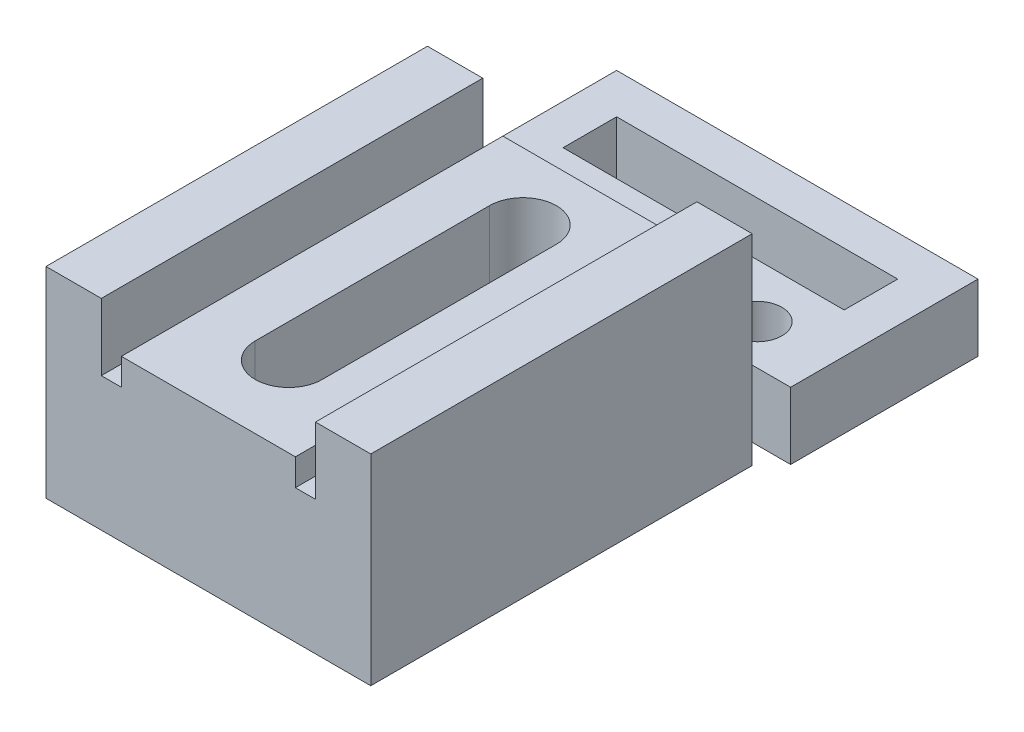
ISO-10303-21;
HEADER;
FILE_DESCRIPTION(('STEP AP214'),'2;1');
FILE_NAME('part.step','',(''),(''),'','','');
FILE_SCHEMA(('AUTOMOTIVE_DESIGN { 1 0 10303 214 1 1 1 1 }'));
ENDSEC;
DATA;
#1=APPLICATION_CONTEXT('core data for automotive mechanical design processes');
#2=APPLICATION_PROTOCOL_DEFINITION('international standard','automotive_design',2000,#1);
#3=PRODUCT_CONTEXT('',#1,'mechanical');
#4=PRODUCT('Part','Part','',(#3));
#5=PRODUCT_RELATED_PRODUCT_CATEGORY('part','',(#4));
#6=PRODUCT_DEFINITION_FORMATION('','',#4);
#7=PRODUCT_DEFINITION_CONTEXT('part definition',#1,'design');
#8=PRODUCT_DEFINITION('design','',#6,#7);
#9=PRODUCT_DEFINITION_SHAPE('','',#8);
#10=(LENGTH_UNIT() NAMED_UNIT(*) SI_UNIT(.MILLI.,.METRE.));
#11=(NAMED_UNIT(*) PLANE_ANGLE_UNIT() SI_UNIT($,.RADIAN.));
#12=(NAMED_UNIT(*) SI_UNIT($,.STERADIAN.) SOLID_ANGLE_UNIT());
#13=UNCERTAINTY_MEASURE_WITH_UNIT(LENGTH_MEASURE(1.E-05),#10,'distance_accuracy_value','');
#14=(GEOMETRIC_REPRESENTATION_CONTEXT(3) GLOBAL_UNCERTAINTY_ASSIGNED_CONTEXT((#13)) GLOBAL_UNIT_ASSIGNED_CONTEXT((#10,
#11,#12)) REPRESENTATION_CONTEXT('',''));
#15=CARTESIAN_POINT('',(0.,0.,0.));
#16=DIRECTION('',(0.,0.,1.));
#17=DIRECTION('',(1.,0.,0.));
#18=AXIS2_PLACEMENT_3D('',#15,#16,#17);
#19=CARTESIAN_POINT('',(-1.,3.84883279739196,-79.6616330776864));
#20=DIRECTION('',(0.,1.,0.));
#21=DIRECTION('',(-1.,0.,0.));
#22=AXIS2_PLACEMENT_3D('',#19,#20,#21);
#23=PLANE('',#22);
#24=DIRECTION('',(0.,0.,-1.));
#25=VECTOR('',#24,1.);
#26=CARTESIAN_POINT('',(-15.5,3.84883279739196,-78.1616330776864));
#27=LINE('',#26,#25);
#28=CARTESIAN_POINT('',(-15.5,3.84883279739196,-49.6616330776864));
#29=VERTEX_POINT('',#28);
#30=CARTESIAN_POINT('',(-15.5,3.84883279739196,-78.1616330776864));
#31=VERTEX_POINT('',#30);
#32=EDGE_CURVE('E279',#29,#31,#27,.T.);
#33=ORIENTED_EDGE('',*,*,#32,.F.);
#34=DIRECTION('',(-1.,0.,0.));
#35=VECTOR('',#34,1.);
#36=CARTESIAN_POINT('',(-1.,3.84883279739196,-49.6616330776864));
#37=LINE('',#36,#35);
#38=CARTESIAN_POINT('',(-2.5,3.84883279739196,-49.6616330776864));
#39=VERTEX_POINT('',#38);
#40=EDGE_CURVE('E520',#39,#29,#37,.T.);
#41=ORIENTED_EDGE('',*,*,#40,.F.);
#42=DIRECTION('',(0.,0.,1.));
#43=VECTOR('',#42,1.);
#44=CARTESIAN_POINT('',(-2.5,3.84883279739196,-78.1616330776864));
#45=LINE('',#44,#43);
#46=CARTESIAN_POINT('',(-2.5,3.84883279739196,-78.1616330776864));
#47=VERTEX_POINT('',#46);
#48=EDGE_CURVE('E273',#47,#39,#45,.T.);
#49=ORIENTED_EDGE('',*,*,#48,.F.);
#50=DIRECTION('',(-1.,0.,0.));
#51=VECTOR('',#50,1.);
#52=CARTESIAN_POINT('',(4.501,3.84883279739196,-78.1616330776864));
#53=LINE('',#52,#51);
#54=EDGE_CURVE('E385',#47,#31,#53,.T.);
#55=ORIENTED_EDGE('',*,*,#54,.T.);
#56=EDGE_LOOP('',(#33,#41,#49,#55));
#57=FACE_BOUND('',#56,.T.);
#58=CARTESIAN_POINT('',(-9.,3.84883279739196,-55.6616330776864));
#59=DIRECTION('',(0.,1.,0.));
#60=DIRECTION('',(-1.,0.,0.));
#61=AXIS2_PLACEMENT_3D('',#58,#59,#60);
#62=CIRCLE('',#61,2.5);
#63=CARTESIAN_POINT('',(-6.5,3.84883279739196,-55.6616330776864));
#64=VERTEX_POINT('',#63);
#65=CARTESIAN_POINT('',(-11.5,3.84883279739196,-55.6616330776864));
#66=VERTEX_POINT('',#65);
#67=EDGE_CURVE('E255',#64,#66,#62,.F.);
#68=ORIENTED_EDGE('',*,*,#67,.T.);
#69=DIRECTION('',(0.,0.,1.));
#70=VECTOR('',#69,1.);
#71=CARTESIAN_POINT('',(-11.5,3.84883279739196,-79.6616330776864));
#72=LINE('',#71,#70);
#73=CARTESIAN_POINT('',(-11.5,3.84883279739196,-73.1616330776864));
#74=VERTEX_POINT('',#73);
#75=EDGE_CURVE('E237',#74,#66,#72,.T.);
#76=ORIENTED_EDGE('',*,*,#75,.F.);
#77=CARTESIAN_POINT('',(-9.,3.84883279739196,-73.1616330776864));
#78=DIRECTION('',(0.,1.,0.));
#79=DIRECTION('',(0.,0.,1.));
#80=AXIS2_PLACEMENT_3D('',#77,#78,#79);
#81=CIRCLE('',#80,2.5);
#82=CARTESIAN_POINT('',(-6.5,3.84883279739196,-73.1616330776864));
#83=VERTEX_POINT('',#82);
#84=EDGE_CURVE('E516',#83,#74,#81,.T.);
#85=ORIENTED_EDGE('',*,*,#84,.F.);
#86=DIRECTION('',(0.,0.,-1.));
#87=VECTOR('',#86,1.);
#88=CARTESIAN_POINT('',(-6.5,3.84883279739196,-79.6616330776864));
#89=LINE('',#88,#87);
#90=EDGE_CURVE('E266',#64,#83,#89,.T.);
#91=ORIENTED_EDGE('',*,*,#90,.F.);
#92=EDGE_LOOP('',(#68,#76,#85,#91));
#93=FACE_BOUND('',#92,.T.);
#94=ADVANCED_FACE('F40',(#57,#93),#23,.T.);
#95=CARTESIAN_POINT('',(0.,-8.15116720260804,0.));
#96=DIRECTION('',(0.,-1.,0.));
#97=DIRECTION('',(0.,0.,-1.));
#98=AXIS2_PLACEMENT_3D('',#95,#96,#97);
#99=PLANE('',#98);
#100=DIRECTION('',(0.,0.,1.));
#101=VECTOR('',#100,1.);
#102=CARTESIAN_POINT('',(1.5,-8.15116720260804,-86.6616330776864));
#103=LINE('',#102,#101);
#104=CARTESIAN_POINT('',(1.5,-8.15116720260804,-90.6616330776864));
#105=VERTEX_POINT('',#104);
#106=CARTESIAN_POINT('',(1.5,-8.15116720260804,-86.6616330776864));
#107=VERTEX_POINT('',#106);
#108=EDGE_CURVE('E404',#105,#107,#103,.T.);
#109=ORIENTED_EDGE('',*,*,#108,.F.);
#110=DIRECTION('',(1.,0.,0.));
#111=VECTOR('',#110,1.);
#112=CARTESIAN_POINT('',(1.5,-8.15116720260804,-90.6616330776864));
#113=LINE('',#112,#111);
#114=CARTESIAN_POINT('',(-19.5,-8.15116720260804,-90.6616330776864));
#115=VERTEX_POINT('',#114);
#116=EDGE_CURVE('E415',#115,#105,#113,.T.);
#117=ORIENTED_EDGE('',*,*,#116,.F.);
#118=DIRECTION('',(0.,0.,-1.));
#119=VECTOR('',#118,1.);
#120=CARTESIAN_POINT('',(-19.5,-8.15116720260804,-90.6616330776864));
#121=LINE('',#120,#119);
#122=CARTESIAN_POINT('',(-19.5,-8.15116720260804,-86.6616330776864));
#123=VERTEX_POINT('',#122);
#124=EDGE_CURVE('E411',#123,#115,#121,.T.);
#125=ORIENTED_EDGE('',*,*,#124,.F.);
#126=DIRECTION('',(-1.,0.,0.));
#127=VECTOR('',#126,1.);
#128=CARTESIAN_POINT('',(-19.5,-8.15116720260804,-86.6616330776864));
#129=LINE('',#128,#127);
#130=EDGE_CURVE('E407',#107,#123,#129,.T.);
#131=ORIENTED_EDGE('',*,*,#130,.F.);
#132=EDGE_LOOP('',(#109,#117,#125,#131));
#133=FACE_BOUND('',#132,.T.);
#134=DIRECTION('',(-1.,0.,0.));
#135=VECTOR('',#134,1.);
#136=CARTESIAN_POINT('',(0.,-8.15116720260804,-49.6616330776864));
#137=LINE('',#136,#135);
#138=CARTESIAN_POINT('',(3.13183387502036,-8.15116720260804,-49.6616330776864));
#139=VERTEX_POINT('',#138);
#140=CARTESIAN_POINT('',(-21.1318338750204,-8.15116720260804,-49.6616330776864));
#141=VERTEX_POINT('',#140);
#142=EDGE_CURVE('E460',#139,#141,#137,.T.);
#143=ORIENTED_EDGE('',*,*,#142,.T.);
#144=DIRECTION('',(0.,0.,-1.));
#145=VECTOR('',#144,1.);
#146=CARTESIAN_POINT('',(-21.1318338750204,-8.15116720260804,-49.6616330776864));
#147=LINE('',#146,#145);
#148=CARTESIAN_POINT('',(-21.1318338750204,-8.15116720260804,-78.1616330776864));
#149=VERTEX_POINT('',#148);
#150=EDGE_CURVE('E337',#141,#149,#147,.T.);
#151=ORIENTED_EDGE('',*,*,#150,.T.);
#152=DIRECTION('',(-1.,0.,0.));
#153=VECTOR('',#152,1.);
#154=CARTESIAN_POINT('',(-18.,-8.15116720260804,-78.1616330776864));
#155=LINE('',#154,#153);
#156=CARTESIAN_POINT('',(-18.,-8.15116720260804,-78.1616330776864));
#157=VERTEX_POINT('',#156);
#158=EDGE_CURVE('E354',#157,#149,#155,.T.);
#159=ORIENTED_EDGE('',*,*,#158,.F.);
#160=DIRECTION('',(0.,0.,-1.));
#161=VECTOR('',#160,1.);
#162=CARTESIAN_POINT('',(-18.,-8.15116720260804,0.));
#163=LINE('',#162,#161);
#164=CARTESIAN_POINT('',(-18.,-8.15116720260804,-79.6616330776864));
#165=VERTEX_POINT('',#164);
#166=EDGE_CURVE('E437',#157,#165,#163,.T.);
#167=ORIENTED_EDGE('',*,*,#166,.T.);
#168=DIRECTION('',(1.,0.,0.));
#169=VECTOR('',#168,1.);
#170=CARTESIAN_POINT('',(0.,-8.15116720260804,-79.6616330776864));
#171=LINE('',#170,#169);
#172=CARTESIAN_POINT('',(-22.5,-8.15116720260804,-79.6616330776864));
#173=VERTEX_POINT('',#172);
#174=EDGE_CURVE('E440',#173,#165,#171,.T.);
#175=ORIENTED_EDGE('',*,*,#174,.F.);
#176=DIRECTION('',(0.,0.,1.));
#177=VECTOR('',#176,1.);
#178=CARTESIAN_POINT('',(-22.5,-8.15116720260804,0.));
#179=LINE('',#178,#177);
#180=CARTESIAN_POINT('',(-22.5,-8.15116720260804,-93.6616330776864));
#181=VERTEX_POINT('',#180);
#182=EDGE_CURVE('E445',#181,#173,#179,.T.);
#183=ORIENTED_EDGE('',*,*,#182,.F.);
#184=DIRECTION('',(1.,0.,0.));
#185=VECTOR('',#184,1.);
#186=CARTESIAN_POINT('',(0.,-8.15116720260804,-93.6616330776864));
#187=LINE('',#186,#185);
#188=CARTESIAN_POINT('',(4.5,-8.15116720260804,-93.6616330776864));
#189=VERTEX_POINT('',#188);
#190=EDGE_CURVE('E450',#181,#189,#187,.T.);
#191=ORIENTED_EDGE('',*,*,#190,.T.);
#192=DIRECTION('',(0.,0.,1.));
#193=VECTOR('',#192,1.);
#194=CARTESIAN_POINT('',(4.5,-8.15116720260804,0.));
#195=LINE('',#194,#193);
#196=CARTESIAN_POINT('',(4.5,-8.15116720260804,-79.6616330776864));
#197=VERTEX_POINT('',#196);
#198=EDGE_CURVE('E453',#189,#197,#195,.T.);
#199=ORIENTED_EDGE('',*,*,#198,.T.);
#200=CARTESIAN_POINT('',(0.,-8.15116720260804,-79.6616330776864));
#201=VERTEX_POINT('',#200);
#202=EDGE_CURVE('E446',#201,#197,#171,.T.);
#203=ORIENTED_EDGE('',*,*,#202,.F.);
#204=DIRECTION('',(0.,0.,1.));
#205=VECTOR('',#204,1.);
#206=CARTESIAN_POINT('',(0.,-8.15116720260804,0.));
#207=LINE('',#206,#205);
#208=CARTESIAN_POINT('',(0.,-8.15116720260804,-78.1616330776864));
#209=VERTEX_POINT('',#208);
#210=EDGE_CURVE('E456',#201,#209,#207,.T.);
#211=ORIENTED_EDGE('',*,*,#210,.T.);
#212=DIRECTION('',(1.,0.,0.));
#213=VECTOR('',#212,1.);
#214=CARTESIAN_POINT('',(0.,-8.15116720260804,-78.1616330776864));
#215=LINE('',#214,#213);
#216=CARTESIAN_POINT('',(3.13183387502036,-8.15116720260804,-78.1616330776864));
#217=VERTEX_POINT('',#216);
#218=EDGE_CURVE('E334',#209,#217,#215,.T.);
#219=ORIENTED_EDGE('',*,*,#218,.T.);
#220=DIRECTION('',(0.,0.,-1.));
#221=VECTOR('',#220,1.);
#222=CARTESIAN_POINT('',(3.13183387502036,-8.15116720260804,-49.6616330776864));
#223=LINE('',#222,#221);
#224=EDGE_CURVE('E330',#139,#217,#223,.T.);
#225=ORIENTED_EDGE('',*,*,#224,.F.);
#226=EDGE_LOOP('',(#143,#151,#159,#167,#175,#183,#191,#199,#203,#211,#219,#225));
#227=FACE_BOUND('',#226,.T.);
#228=CARTESIAN_POINT('',(-17.,-8.15116720260804,-82.6616330776864));
#229=DIRECTION('',(0.,-1.,0.));
#230=DIRECTION('',(0.,0.,-1.));
#231=AXIS2_PLACEMENT_3D('',#228,#229,#230);
#232=CIRCLE('',#231,1.85000000000001);
#233=CARTESIAN_POINT('',(-17.,-8.15116720260804,-84.5116330776864));
#234=VERTEX_POINT('',#233);
#235=EDGE_CURVE('E465',#234,#234,#232,.T.);
#236=ORIENTED_EDGE('',*,*,#235,.F.);
#237=EDGE_LOOP('',(#236));
#238=FACE_BOUND('',#237,.T.);
#239=CARTESIAN_POINT('',(-1.,-8.15116720260804,-82.6616330776864));
#240=DIRECTION('',(0.,-1.,0.));
#241=DIRECTION('',(0.,0.,-1.));
#242=AXIS2_PLACEMENT_3D('',#239,#240,#241);
#243=CIRCLE('',#242,1.85);
#244=CARTESIAN_POINT('',(-1.,-8.15116720260804,-84.5116330776864));
#245=VERTEX_POINT('',#244);
#246=EDGE_CURVE('E469',#245,#245,#243,.F.);
#247=ORIENTED_EDGE('',*,*,#246,.T.);
#248=EDGE_LOOP('',(#247));
#249=FACE_BOUND('',#248,.T.);
#250=DIRECTION('',(0.,0.,-1.));
#251=VECTOR('',#250,1.);
#252=CARTESIAN_POINT('',(-11.5,-8.15116720260804,-79.6616330776864));
#253=LINE('',#252,#251);
#254=CARTESIAN_POINT('',(-11.5,-8.15116720260804,-55.6616330776864));
#255=VERTEX_POINT('',#254);
#256=CARTESIAN_POINT('',(-11.5,-8.15116720260804,-73.1616330776864));
#257=VERTEX_POINT('',#256);
#258=EDGE_CURVE('E227',#255,#257,#253,.T.);
#259=ORIENTED_EDGE('',*,*,#258,.F.);
#260=CARTESIAN_POINT('',(-9.,-8.15116720260804,-55.6616330776864));
#261=DIRECTION('',(0.,-1.,0.));
#262=DIRECTION('',(0.,0.,-1.));
#263=AXIS2_PLACEMENT_3D('',#260,#261,#262);
#264=CIRCLE('',#263,2.5);
#265=CARTESIAN_POINT('',(-6.5,-8.15116720260804,-55.6616330776864));
#266=VERTEX_POINT('',#265);
#267=EDGE_CURVE('E231',#255,#266,#264,.F.);
#268=ORIENTED_EDGE('',*,*,#267,.T.);
#269=DIRECTION('',(0.,0.,1.));
#270=VECTOR('',#269,1.);
#271=CARTESIAN_POINT('',(-6.5,-8.15116720260804,-79.6616330776864));
#272=LINE('',#271,#270);
#273=CARTESIAN_POINT('',(-6.5,-8.15116720260804,-73.1616330776864));
#274=VERTEX_POINT('',#273);
#275=EDGE_CURVE('E248',#274,#266,#272,.T.);
#276=ORIENTED_EDGE('',*,*,#275,.F.);
#277=CARTESIAN_POINT('',(-9.,-8.15116720260804,-73.1616330776864));
#278=DIRECTION('',(0.,-1.,0.));
#279=DIRECTION('',(0.,0.,-1.));
#280=AXIS2_PLACEMENT_3D('',#277,#278,#279);
#281=CIRCLE('',#280,2.5);
#282=EDGE_CURVE('E233',#274,#257,#281,.F.);
#283=ORIENTED_EDGE('',*,*,#282,.T.);
#284=EDGE_LOOP('',(#259,#268,#276,#283));
#285=FACE_BOUND('',#284,.T.);
#286=ADVANCED_FACE('F229',(#133,#227,#238,#249,#285),#99,.T.);
#287=CARTESIAN_POINT('',(0.,0.,0.));
#288=DIRECTION('',(1.,0.,0.));
#289=DIRECTION('',(0.,0.,-1.));
#290=AXIS2_PLACEMENT_3D('',#287,#288,#289);
#291=PLANE('',#290);
#292=DIRECTION('',(0.,0.,1.));
#293=VECTOR('',#292,1.);
#294=CARTESIAN_POINT('',(0.,-3.15116720260804,-79.6616330776864));
#295=LINE('',#294,#293);
#296=CARTESIAN_POINT('',(0.,-3.15116720260804,-79.6616330776864));
#297=VERTEX_POINT('',#296);
#298=CARTESIAN_POINT('',(0.,-3.15116720260804,-78.1616330776864));
#299=VERTEX_POINT('',#298);
#300=EDGE_CURVE('E378',#297,#299,#295,.T.);
#301=ORIENTED_EDGE('',*,*,#300,.T.);
#302=DIRECTION('',(0.,1.,0.));
#303=VECTOR('',#302,1.);
#304=CARTESIAN_POINT('',(0.,-36.8227277360133,-78.1616330776864));
#305=LINE('',#304,#303);
#306=EDGE_CURVE('E325',#209,#299,#305,.T.);
#307=ORIENTED_EDGE('',*,*,#306,.F.);
#308=ORIENTED_EDGE('',*,*,#210,.F.);
#309=DIRECTION('',(0.,1.,0.));
#310=VECTOR('',#309,1.);
#311=CARTESIAN_POINT('',(0.,-8.15116720260804,-79.6616330776864));
#312=LINE('',#311,#310);
#313=EDGE_CURVE('E473',#201,#297,#312,.T.);
#314=ORIENTED_EDGE('',*,*,#313,.T.);
#315=EDGE_LOOP('',(#301,#307,#308,#314));
#316=FACE_BOUND('',#315,.T.);
#317=ADVANCED_FACE('F582',(#316),#291,.T.);
#318=CARTESIAN_POINT('',(-18.,6.84883279739196,-49.6616330776864));
#319=DIRECTION('',(0.,0.,1.));
#320=DIRECTION('',(1.,0.,0.));
#321=AXIS2_PLACEMENT_3D('',#318,#319,#320);
#322=PLANE('',#321);
#323=DIRECTION('',(1.,0.,0.));
#324=VECTOR('',#323,1.);
#325=CARTESIAN_POINT('',(-17.,1.84883279739196,-49.6616330776864));
#326=LINE('',#325,#324);
#327=CARTESIAN_POINT('',(-17.,1.84883279739196,-49.6616330776864));
#328=VERTEX_POINT('',#327);
#329=CARTESIAN_POINT('',(-15.5,1.84883279739196,-49.6616330776864));
#330=VERTEX_POINT('',#329);
#331=EDGE_CURVE('E278',#328,#330,#326,.T.);
#332=ORIENTED_EDGE('',*,*,#331,.F.);
#333=DIRECTION('',(0.,1.,0.));
#334=VECTOR('',#333,1.);
#335=CARTESIAN_POINT('',(-17.,3.84883279739196,-49.6616330776864));
#336=LINE('',#335,#334);
#337=CARTESIAN_POINT('',(-17.,6.84883279739196,-49.6616330776864));
#338=VERTEX_POINT('',#337);
#339=EDGE_CURVE('E524',#328,#338,#336,.T.);
#340=ORIENTED_EDGE('',*,*,#339,.T.);
#341=DIRECTION('',(1.,0.,0.));
#342=VECTOR('',#341,1.);
#343=CARTESIAN_POINT('',(-18.,6.84883279739196,-49.6616330776864));
#344=LINE('',#343,#342);
#345=CARTESIAN_POINT('',(-21.1318338750204,6.84883279739195,-49.6616330776864));
#346=VERTEX_POINT('',#345);
#347=EDGE_CURVE('E11',#346,#338,#344,.T.);
#348=ORIENTED_EDGE('',*,*,#347,.F.);
#349=DIRECTION('',(0.,1.,0.));
#350=VECTOR('',#349,1.);
#351=CARTESIAN_POINT('',(-21.1318338750204,-36.8227277360133,-49.6616330776864));
#352=LINE('',#351,#350);
#353=EDGE_CURVE('E350',#141,#346,#352,.T.);
#354=ORIENTED_EDGE('',*,*,#353,.F.);
#355=ORIENTED_EDGE('',*,*,#142,.F.);
#356=DIRECTION('',(0.,1.,0.));
#357=VECTOR('',#356,1.);
#358=CARTESIAN_POINT('',(3.13183387502036,-36.8227277360133,-49.6616330776864));
#359=LINE('',#358,#357);
#360=CARTESIAN_POINT('',(3.13183387502036,6.84883279739195,-49.6616330776864));
#361=VERTEX_POINT('',#360);
#362=EDGE_CURVE('E295',#139,#361,#359,.T.);
#363=ORIENTED_EDGE('',*,*,#362,.T.);
#364=CARTESIAN_POINT('',(-1.,6.84883279739196,-49.6616330776864));
#365=VERTEX_POINT('',#364);
#366=EDGE_CURVE('E49',#365,#361,#344,.T.);
#367=ORIENTED_EDGE('',*,*,#366,.F.);
#368=DIRECTION('',(0.,-1.,0.));
#369=VECTOR('',#368,1.);
#370=CARTESIAN_POINT('',(-1.,6.84883279739196,-49.6616330776864));
#371=LINE('',#370,#369);
#372=CARTESIAN_POINT('',(-1.,1.84883279739196,-49.6616330776864));
#373=VERTEX_POINT('',#372);
#374=EDGE_CURVE('E528',#365,#373,#371,.T.);
#375=ORIENTED_EDGE('',*,*,#374,.T.);
#376=DIRECTION('',(1.,0.,0.));
#377=VECTOR('',#376,1.);
#378=CARTESIAN_POINT('',(-1.,1.84883279739196,-49.6616330776864));
#379=LINE('',#378,#377);
#380=CARTESIAN_POINT('',(-2.5,1.84883279739196,-49.6616330776864));
#381=VERTEX_POINT('',#380);
#382=EDGE_CURVE('E310',#381,#373,#379,.T.);
#383=ORIENTED_EDGE('',*,*,#382,.F.);
#384=DIRECTION('',(0.,1.,0.));
#385=VECTOR('',#384,1.);
#386=CARTESIAN_POINT('',(-2.5,1.84883279739196,-49.6616330776864));
#387=LINE('',#386,#385);
#388=EDGE_CURVE('E290',#381,#39,#387,.T.);
#389=ORIENTED_EDGE('',*,*,#388,.T.);
#390=ORIENTED_EDGE('',*,*,#40,.T.);
#391=DIRECTION('',(0.,1.,0.));
#392=VECTOR('',#391,1.);
#393=CARTESIAN_POINT('',(-15.5,1.84883279739196,-49.6616330776864));
#394=LINE('',#393,#392);
#395=EDGE_CURVE('E287',#330,#29,#394,.T.);
#396=ORIENTED_EDGE('',*,*,#395,.F.);
#397=EDGE_LOOP('',(#332,#340,#348,#354,#355,#363,#367,#375,#383,#389,#390,#396));
#398=FACE_BOUND('',#397,.T.);
#399=ADVANCED_FACE('F548',(#398),#322,.T.);
#400=CARTESIAN_POINT('',(-18.,6.84883279739196,-79.6616330776864));
#401=DIRECTION('',(0.,1.,0.));
#402=DIRECTION('',(0.,0.,1.));
#403=AXIS2_PLACEMENT_3D('',#400,#401,#402);
#404=PLANE('',#403);
#405=DIRECTION('',(-1.,0.,0.));
#406=VECTOR('',#405,1.);
#407=CARTESIAN_POINT('',(4.501,6.84883279739196,-78.1616330776864));
#408=LINE('',#407,#406);
#409=CARTESIAN_POINT('',(-17.,6.84883279739196,-78.1616330776864));
#410=VERTEX_POINT('',#409);
#411=CARTESIAN_POINT('',(-21.1318338750204,6.84883279739195,-78.1616330776864));
#412=VERTEX_POINT('',#411);
#413=EDGE_CURVE('E371',#410,#412,#408,.T.);
#414=ORIENTED_EDGE('',*,*,#413,.T.);
#415=DIRECTION('',(0.,0.,-1.));
#416=VECTOR('',#415,1.);
#417=CARTESIAN_POINT('',(-21.1318338750204,6.84883279739195,-49.6616330776864));
#418=LINE('',#417,#416);
#419=EDGE_CURVE('E345',#346,#412,#418,.T.);
#420=ORIENTED_EDGE('',*,*,#419,.F.);
#421=ORIENTED_EDGE('',*,*,#347,.T.);
#422=DIRECTION('',(0.,0.,1.));
#423=VECTOR('',#422,1.);
#424=CARTESIAN_POINT('',(-17.,6.84883279739196,-79.6616330776864));
#425=LINE('',#424,#423);
#426=EDGE_CURVE('E533',#410,#338,#425,.T.);
#427=ORIENTED_EDGE('',*,*,#426,.F.);
#428=EDGE_LOOP('',(#414,#420,#421,#427));
#429=FACE_BOUND('',#428,.T.);
#430=ADVANCED_FACE('F42',(#429),#404,.T.);
#431=CARTESIAN_POINT('',(3.13183387502036,6.84883279739195,-78.1616330776864));
#432=VERTEX_POINT('',#431);
#433=CARTESIAN_POINT('',(-1.,6.84883279739196,-78.1616330776864));
#434=VERTEX_POINT('',#433);
#435=EDGE_CURVE('E374',#432,#434,#408,.T.);
#436=ORIENTED_EDGE('',*,*,#435,.T.);
#437=DIRECTION('',(0.,0.,1.));
#438=VECTOR('',#437,1.);
#439=CARTESIAN_POINT('',(-1.,6.84883279739196,-79.6616330776864));
#440=LINE('',#439,#438);
#441=EDGE_CURVE('E531',#434,#365,#440,.T.);
#442=ORIENTED_EDGE('',*,*,#441,.T.);
#443=ORIENTED_EDGE('',*,*,#366,.T.);
#444=DIRECTION('',(0.,0.,-1.));
#445=VECTOR('',#444,1.);
#446=CARTESIAN_POINT('',(3.13183387502036,6.84883279739195,-49.6616330776864));
#447=LINE('',#446,#445);
#448=EDGE_CURVE('E338',#361,#432,#447,.T.);
#449=ORIENTED_EDGE('',*,*,#448,.T.);
#450=EDGE_LOOP('',(#436,#442,#443,#449));
#451=FACE_BOUND('',#450,.T.);
#452=ADVANCED_FACE('F541',(#451),#404,.T.);
#453=CARTESIAN_POINT('',(-18.,0.,0.));
#454=DIRECTION('',(1.,0.,0.));
#455=DIRECTION('',(0.,0.,-1.));
#456=AXIS2_PLACEMENT_3D('',#453,#454,#455);
#457=PLANE('',#456);
#458=ORIENTED_EDGE('',*,*,#166,.F.);
#459=DIRECTION('',(0.,1.,0.));
#460=VECTOR('',#459,1.);
#461=CARTESIAN_POINT('',(-18.,-36.8227277360133,-78.1616330776864));
#462=LINE('',#461,#460);
#463=CARTESIAN_POINT('',(-18.,-3.15116720260804,-78.1616330776864));
#464=VERTEX_POINT('',#463);
#465=EDGE_CURVE('E353',#157,#464,#462,.T.);
#466=ORIENTED_EDGE('',*,*,#465,.T.);
#467=DIRECTION('',(0.,0.,1.));
#468=VECTOR('',#467,1.);
#469=CARTESIAN_POINT('',(-18.,-3.15116720260804,-79.6616330776864));
#470=LINE('',#469,#468);
#471=CARTESIAN_POINT('',(-18.,-3.15116720260804,-79.6616330776864));
#472=VERTEX_POINT('',#471);
#473=EDGE_CURVE('E349',#472,#464,#470,.T.);
#474=ORIENTED_EDGE('',*,*,#473,.F.);
#475=DIRECTION('',(0.,1.,0.));
#476=VECTOR('',#475,1.);
#477=CARTESIAN_POINT('',(-18.,-8.15116720260804,-79.6616330776864));
#478=LINE('',#477,#476);
#479=EDGE_CURVE('E512',#165,#472,#478,.T.);
#480=ORIENTED_EDGE('',*,*,#479,.F.);
#481=EDGE_LOOP('',(#458,#466,#474,#480));
#482=FACE_BOUND('',#481,.T.);
#483=ADVANCED_FACE('F588',(#482),#457,.F.);
#484=CARTESIAN_POINT('',(-17.,3.84883279739196,-79.6616330776864));
#485=DIRECTION('',(1.,0.,0.));
#486=DIRECTION('',(0.,0.,-1.));
#487=AXIS2_PLACEMENT_3D('',#484,#485,#486);
#488=PLANE('',#487);
#489=DIRECTION('',(0.,1.,0.));
#490=VECTOR('',#489,1.);
#491=CARTESIAN_POINT('',(-17.,-3.15116720260804,-78.1616330776864));
#492=LINE('',#491,#490);
#493=CARTESIAN_POINT('',(-17.,1.84883279739196,-78.1616330776864));
#494=VERTEX_POINT('',#493);
#495=EDGE_CURVE('E389',#494,#410,#492,.T.);
#496=ORIENTED_EDGE('',*,*,#495,.T.);
#497=ORIENTED_EDGE('',*,*,#426,.T.);
#498=ORIENTED_EDGE('',*,*,#339,.F.);
#499=DIRECTION('',(0.,0.,1.));
#500=VECTOR('',#499,1.);
#501=CARTESIAN_POINT('',(-17.,1.84883279739196,-78.1616330776864));
#502=LINE('',#501,#500);
#503=EDGE_CURVE('E274',#494,#328,#502,.T.);
#504=ORIENTED_EDGE('',*,*,#503,.F.);
#505=EDGE_LOOP('',(#496,#497,#498,#504));
#506=FACE_BOUND('',#505,.T.);
#507=ADVANCED_FACE('F617',(#506),#488,.T.);
#508=CARTESIAN_POINT('',(-1.,6.84883279739196,-79.6616330776864));
#509=DIRECTION('',(-1.,0.,0.));
#510=DIRECTION('',(0.,0.,1.));
#511=AXIS2_PLACEMENT_3D('',#508,#509,#510);
#512=PLANE('',#511);
#513=DIRECTION('',(0.,-1.,0.));
#514=VECTOR('',#513,1.);
#515=CARTESIAN_POINT('',(-1.,-3.15116720260804,-78.1616330776864));
#516=LINE('',#515,#514);
#517=CARTESIAN_POINT('',(-1.,1.84883279739196,-78.1616330776864));
#518=VERTEX_POINT('',#517);
#519=EDGE_CURVE('E382',#434,#518,#516,.T.);
#520=ORIENTED_EDGE('',*,*,#519,.T.);
#521=DIRECTION('',(0.,0.,-1.));
#522=VECTOR('',#521,1.);
#523=CARTESIAN_POINT('',(-1.,1.84883279739196,-78.1616330776864));
#524=LINE('',#523,#522);
#525=EDGE_CURVE('E298',#373,#518,#524,.T.);
#526=ORIENTED_EDGE('',*,*,#525,.F.);
#527=ORIENTED_EDGE('',*,*,#374,.F.);
#528=ORIENTED_EDGE('',*,*,#441,.F.);
#529=EDGE_LOOP('',(#520,#526,#527,#528));
#530=FACE_BOUND('',#529,.T.);
#531=ADVANCED_FACE('F651',(#530),#512,.T.);
#532=CARTESIAN_POINT('',(-9.,3.84883279739196,-73.1616330776864));
#533=DIRECTION('',(0.,1.,0.));
#534=DIRECTION('',(0.,0.,1.));
#535=AXIS2_PLACEMENT_3D('',#532,#533,#534);
#536=CYLINDRICAL_SURFACE('',#535,2.5);
#537=ORIENTED_EDGE('',*,*,#84,.T.);
#538=DIRECTION('',(0.,1.,0.));
#539=VECTOR('',#538,1.);
#540=CARTESIAN_POINT('',(-11.5,-8.15216720260804,-73.1616330776864));
#541=LINE('',#540,#539);
#542=EDGE_CURVE('E238',#257,#74,#541,.T.);
#543=ORIENTED_EDGE('',*,*,#542,.F.);
#544=ORIENTED_EDGE('',*,*,#282,.F.);
#545=DIRECTION('',(0.,1.,0.));
#546=VECTOR('',#545,1.);
#547=CARTESIAN_POINT('',(-6.5,3.84883279739196,-73.1616330776864));
#548=LINE('',#547,#546);
#549=EDGE_CURVE('E56',#274,#83,#548,.T.);
#550=ORIENTED_EDGE('',*,*,#549,.T.);
#551=EDGE_LOOP('',(#537,#543,#544,#550));
#552=FACE_BOUND('',#551,.T.);
#553=ADVANCED_FACE('F653',(#552),#536,.F.);
#554=CARTESIAN_POINT('',(0.,-3.15116720260804,0.));
#555=DIRECTION('',(0.,-1.,0.));
#556=DIRECTION('',(0.,0.,-1.));
#557=AXIS2_PLACEMENT_3D('',#554,#555,#556);
#558=PLANE('',#557);
#559=DIRECTION('',(-1.,0.,0.));
#560=VECTOR('',#559,1.);
#561=CARTESIAN_POINT('',(1.5,-3.15116720260804,-90.6616330776864));
#562=LINE('',#561,#560);
#563=CARTESIAN_POINT('',(1.5,-3.15116720260804,-90.6616330776864));
#564=VERTEX_POINT('',#563);
#565=CARTESIAN_POINT('',(-19.5,-3.15116720260804,-90.6616330776864));
#566=VERTEX_POINT('',#565);
#567=EDGE_CURVE('E396',#564,#566,#562,.T.);
#568=ORIENTED_EDGE('',*,*,#567,.F.);
#569=DIRECTION('',(0.,0.,-1.));
#570=VECTOR('',#569,1.);
#571=CARTESIAN_POINT('',(1.5,-3.15116720260804,-86.6616330776864));
#572=LINE('',#571,#570);
#573=CARTESIAN_POINT('',(1.49999999999999,-3.15116720260804,-86.6616330776864));
#574=VERTEX_POINT('',#573);
#575=EDGE_CURVE('E400',#574,#564,#572,.T.);
#576=ORIENTED_EDGE('',*,*,#575,.F.);
#577=DIRECTION('',(1.,0.,0.));
#578=VECTOR('',#577,1.);
#579=CARTESIAN_POINT('',(-19.5,-3.15116720260804,-86.6616330776864));
#580=LINE('',#579,#578);
#581=CARTESIAN_POINT('',(-19.5,-3.15116720260804,-86.6616330776864));
#582=VERTEX_POINT('',#581);
#583=EDGE_CURVE('E423',#582,#574,#580,.T.);
#584=ORIENTED_EDGE('',*,*,#583,.F.);
#585=DIRECTION('',(0.,0.,1.));
#586=VECTOR('',#585,1.);
#587=CARTESIAN_POINT('',(-19.5,-3.15116720260804,-90.6616330776864));
#588=LINE('',#587,#586);
#589=EDGE_CURVE('E393',#566,#582,#588,.T.);
#590=ORIENTED_EDGE('',*,*,#589,.F.);
#591=EDGE_LOOP('',(#568,#576,#584,#590));
#592=FACE_BOUND('',#591,.T.);
#593=CARTESIAN_POINT('',(-1.,-3.15116720260804,-82.6616330776864));
#594=DIRECTION('',(0.,-1.,0.));
#595=DIRECTION('',(0.,0.,-1.));
#596=AXIS2_PLACEMENT_3D('',#593,#594,#595);
#597=CIRCLE('',#596,1.85);
#598=CARTESIAN_POINT('',(-1.,-3.15116720260804,-84.5116330776864));
#599=VERTEX_POINT('',#598);
#600=EDGE_CURVE('E441',#599,#599,#597,.F.);
#601=ORIENTED_EDGE('',*,*,#600,.F.);
#602=EDGE_LOOP('',(#601));
#603=FACE_BOUND('',#602,.T.);
#604=CARTESIAN_POINT('',(-17.,-3.15116720260804,-82.6616330776864));
#605=DIRECTION('',(0.,-1.,0.));
#606=DIRECTION('',(0.,0.,-1.));
#607=AXIS2_PLACEMENT_3D('',#604,#605,#606);
#608=CIRCLE('',#607,1.85000000000001);
#609=CARTESIAN_POINT('',(-17.,-3.15116720260804,-84.5116330776864));
#610=VERTEX_POINT('',#609);
#611=EDGE_CURVE('E489',#610,#610,#608,.T.);
#612=ORIENTED_EDGE('',*,*,#611,.T.);
#613=EDGE_LOOP('',(#612));
#614=FACE_BOUND('',#613,.T.);
#615=DIRECTION('',(1.,0.,0.));
#616=VECTOR('',#615,1.);
#617=CARTESIAN_POINT('',(0.,-3.15116720260804,-79.6616330776864));
#618=LINE('',#617,#616);
#619=CARTESIAN_POINT('',(-22.5,-3.15116720260804,-79.6616330776864));
#620=VERTEX_POINT('',#619);
#621=EDGE_CURVE('E436',#620,#472,#618,.T.);
#622=ORIENTED_EDGE('',*,*,#621,.T.);
#623=ORIENTED_EDGE('',*,*,#473,.T.);
#624=DIRECTION('',(-1.,0.,0.));
#625=VECTOR('',#624,1.);
#626=CARTESIAN_POINT('',(4.501,-3.15116720260804,-78.1616330776864));
#627=LINE('',#626,#625);
#628=EDGE_CURVE('E370',#299,#464,#627,.T.);
#629=ORIENTED_EDGE('',*,*,#628,.F.);
#630=ORIENTED_EDGE('',*,*,#300,.F.);
#631=CARTESIAN_POINT('',(4.5,-3.15116720260804,-79.6616330776864));
#632=VERTEX_POINT('',#631);
#633=EDGE_CURVE('E478',#297,#632,#618,.T.);
#634=ORIENTED_EDGE('',*,*,#633,.T.);
#635=DIRECTION('',(0.,0.,1.));
#636=VECTOR('',#635,1.);
#637=CARTESIAN_POINT('',(4.5,-3.15116720260804,0.));
#638=LINE('',#637,#636);
#639=CARTESIAN_POINT('',(4.5,-3.15116720260804,-93.6616330776864));
#640=VERTEX_POINT('',#639);
#641=EDGE_CURVE('E485',#640,#632,#638,.T.);
#642=ORIENTED_EDGE('',*,*,#641,.F.);
#643=DIRECTION('',(1.,0.,0.));
#644=VECTOR('',#643,1.);
#645=CARTESIAN_POINT('',(0.,-3.15116720260804,-93.6616330776864));
#646=LINE('',#645,#644);
#647=CARTESIAN_POINT('',(-22.5,-3.15116720260804,-93.6616330776864));
#648=VERTEX_POINT('',#647);
#649=EDGE_CURVE('E482',#648,#640,#646,.T.);
#650=ORIENTED_EDGE('',*,*,#649,.F.);
#651=DIRECTION('',(0.,0.,1.));
#652=VECTOR('',#651,1.);
#653=CARTESIAN_POINT('',(-22.5,-3.15116720260804,0.));
#654=LINE('',#653,#652);
#655=EDGE_CURVE('E477',#648,#620,#654,.T.);
#656=ORIENTED_EDGE('',*,*,#655,.T.);
#657=EDGE_LOOP('',(#622,#623,#629,#630,#634,#642,#650,#656));
#658=FACE_BOUND('',#657,.T.);
#659=ADVANCED_FACE('F580',(#592,#603,#614,#658),#558,.F.);
#660=CARTESIAN_POINT('',(0.,-8.15116720260804,-79.6616330776864));
#661=DIRECTION('',(0.,0.,1.));
#662=DIRECTION('',(1.,0.,0.));
#663=AXIS2_PLACEMENT_3D('',#660,#661,#662);
#664=PLANE('',#663);
#665=ORIENTED_EDGE('',*,*,#621,.F.);
#666=DIRECTION('',(0.,1.,0.));
#667=VECTOR('',#666,1.);
#668=CARTESIAN_POINT('',(-22.5,-8.15116720260804,-79.6616330776864));
#669=LINE('',#668,#667);
#670=EDGE_CURVE('E509',#173,#620,#669,.T.);
#671=ORIENTED_EDGE('',*,*,#670,.F.);
#672=ORIENTED_EDGE('',*,*,#174,.T.);
#673=ORIENTED_EDGE('',*,*,#479,.T.);
#674=EDGE_LOOP('',(#665,#671,#672,#673));
#675=FACE_BOUND('',#674,.T.);
#676=ADVANCED_FACE('F590',(#675),#664,.T.);
#677=CARTESIAN_POINT('',(-22.5,-8.15116720260804,0.));
#678=DIRECTION('',(-1.,0.,0.));
#679=DIRECTION('',(0.,0.,1.));
#680=AXIS2_PLACEMENT_3D('',#677,#678,#679);
#681=PLANE('',#680);
#682=ORIENTED_EDGE('',*,*,#655,.F.);
#683=DIRECTION('',(0.,1.,0.));
#684=VECTOR('',#683,1.);
#685=CARTESIAN_POINT('',(-22.5,-8.15116720260804,-93.6616330776864));
#686=LINE('',#685,#684);
#687=EDGE_CURVE('E506',#181,#648,#686,.T.);
#688=ORIENTED_EDGE('',*,*,#687,.F.);
#689=ORIENTED_EDGE('',*,*,#182,.T.);
#690=ORIENTED_EDGE('',*,*,#670,.T.);
#691=EDGE_LOOP('',(#682,#688,#689,#690));
#692=FACE_BOUND('',#691,.T.);
#693=ADVANCED_FACE('F594',(#692),#681,.T.);
#694=CARTESIAN_POINT('',(0.,-8.15116720260804,-93.6616330776864));
#695=DIRECTION('',(0.,0.,1.));
#696=DIRECTION('',(1.,0.,0.));
#697=AXIS2_PLACEMENT_3D('',#694,#695,#696);
#698=PLANE('',#697);
#699=ORIENTED_EDGE('',*,*,#649,.T.);
#700=DIRECTION('',(0.,1.,0.));
#701=VECTOR('',#700,1.);
#702=CARTESIAN_POINT('',(4.5,-8.15116720260804,-93.6616330776864));
#703=LINE('',#702,#701);
#704=EDGE_CURVE('E502',#189,#640,#703,.T.);
#705=ORIENTED_EDGE('',*,*,#704,.F.);
#706=ORIENTED_EDGE('',*,*,#190,.F.);
#707=ORIENTED_EDGE('',*,*,#687,.T.);
#708=EDGE_LOOP('',(#699,#705,#706,#707));
#709=FACE_BOUND('',#708,.T.);
#710=ADVANCED_FACE('F596',(#709),#698,.F.);
#711=CARTESIAN_POINT('',(4.5,-8.15116720260804,0.));
#712=DIRECTION('',(-1.,0.,0.));
#713=DIRECTION('',(0.,0.,1.));
#714=AXIS2_PLACEMENT_3D('',#711,#712,#713);
#715=PLANE('',#714);
#716=ORIENTED_EDGE('',*,*,#641,.T.);
#717=DIRECTION('',(0.,1.,0.));
#718=VECTOR('',#717,1.);
#719=CARTESIAN_POINT('',(4.5,-8.15116720260804,-79.6616330776864));
#720=LINE('',#719,#718);
#721=EDGE_CURVE('E499',#197,#632,#720,.T.);
#722=ORIENTED_EDGE('',*,*,#721,.F.);
#723=ORIENTED_EDGE('',*,*,#198,.F.);
#724=ORIENTED_EDGE('',*,*,#704,.T.);
#725=EDGE_LOOP('',(#716,#722,#723,#724));
#726=FACE_BOUND('',#725,.T.);
#727=ADVANCED_FACE('F576',(#726),#715,.F.);
#728=ORIENTED_EDGE('',*,*,#633,.F.);
#729=ORIENTED_EDGE('',*,*,#313,.F.);
#730=ORIENTED_EDGE('',*,*,#202,.T.);
#731=ORIENTED_EDGE('',*,*,#721,.T.);
#732=EDGE_LOOP('',(#728,#729,#730,#731));
#733=FACE_BOUND('',#732,.T.);
#734=ADVANCED_FACE('F566',(#733),#664,.T.);
#735=CARTESIAN_POINT('',(-17.,-8.15116720260804,-82.6616330776864));
#736=DIRECTION('',(0.,1.,0.));
#737=DIRECTION('',(0.,0.,1.));
#738=AXIS2_PLACEMENT_3D('',#735,#736,#737);
#739=CYLINDRICAL_SURFACE('',#738,1.85000000000001);
#740=ORIENTED_EDGE('',*,*,#235,.T.);
#741=EDGE_LOOP('',(#740));
#742=FACE_BOUND('',#741,.T.);
#743=ORIENTED_EDGE('',*,*,#611,.F.);
#744=EDGE_LOOP('',(#743));
#745=FACE_BOUND('',#744,.T.);
#746=ADVANCED_FACE('F696',(#742,#745),#739,.F.);
#747=CARTESIAN_POINT('',(-1.,-8.15116720260804,-82.6616330776864));
#748=DIRECTION('',(0.,1.,0.));
#749=DIRECTION('',(0.,0.,1.));
#750=AXIS2_PLACEMENT_3D('',#747,#748,#749);
#751=CYLINDRICAL_SURFACE('',#750,1.85);
#752=ORIENTED_EDGE('',*,*,#246,.F.);
#753=EDGE_LOOP('',(#752));
#754=FACE_BOUND('',#753,.T.);
#755=ORIENTED_EDGE('',*,*,#600,.T.);
#756=EDGE_LOOP('',(#755));
#757=FACE_BOUND('',#756,.T.);
#758=ADVANCED_FACE('F751',(#754,#757),#751,.F.);
#759=CARTESIAN_POINT('',(1.5,6.84983279739196,-86.6616330776864));
#760=DIRECTION('',(1.,0.,0.));
#761=DIRECTION('',(0.,0.,-1.));
#762=AXIS2_PLACEMENT_3D('',#759,#760,#761);
#763=PLANE('',#762);
#764=ORIENTED_EDGE('',*,*,#575,.T.);
#765=DIRECTION('',(0.,-1.,0.));
#766=VECTOR('',#765,1.);
#767=CARTESIAN_POINT('',(1.5,6.84983279739196,-90.6616330776864));
#768=LINE('',#767,#766);
#769=EDGE_CURVE('E420',#564,#105,#768,.T.);
#770=ORIENTED_EDGE('',*,*,#769,.T.);
#771=ORIENTED_EDGE('',*,*,#108,.T.);
#772=DIRECTION('',(0.,-1.,0.));
#773=VECTOR('',#772,1.);
#774=CARTESIAN_POINT('',(1.5,6.84983279739196,-86.6616330776864));
#775=LINE('',#774,#773);
#776=EDGE_CURVE('E419',#574,#107,#775,.T.);
#777=ORIENTED_EDGE('',*,*,#776,.F.);
#778=EDGE_LOOP('',(#764,#770,#771,#777));
#779=FACE_BOUND('',#778,.T.);
#780=ADVANCED_FACE('F741',(#779),#763,.F.);
#781=CARTESIAN_POINT('',(1.5,6.84983279739196,-90.6616330776864));
#782=DIRECTION('',(0.,0.,-1.));
#783=DIRECTION('',(-1.,0.,0.));
#784=AXIS2_PLACEMENT_3D('',#781,#782,#783);
#785=PLANE('',#784);
#786=ORIENTED_EDGE('',*,*,#567,.T.);
#787=DIRECTION('',(0.,-1.,0.));
#788=VECTOR('',#787,1.);
#789=CARTESIAN_POINT('',(-19.5,6.84983279739196,-90.6616330776864));
#790=LINE('',#789,#788);
#791=EDGE_CURVE('E424',#566,#115,#790,.T.);
#792=ORIENTED_EDGE('',*,*,#791,.T.);
#793=ORIENTED_EDGE('',*,*,#116,.T.);
#794=ORIENTED_EDGE('',*,*,#769,.F.);
#795=EDGE_LOOP('',(#786,#792,#793,#794));
#796=FACE_BOUND('',#795,.T.);
#797=ADVANCED_FACE('F731',(#796),#785,.F.);
#798=CARTESIAN_POINT('',(-19.5,6.84983279739196,-90.6616330776864));
#799=DIRECTION('',(-1.,0.,0.));
#800=DIRECTION('',(0.,0.,1.));
#801=AXIS2_PLACEMENT_3D('',#798,#799,#800);
#802=PLANE('',#801);
#803=ORIENTED_EDGE('',*,*,#589,.T.);
#804=DIRECTION('',(0.,-1.,0.));
#805=VECTOR('',#804,1.);
#806=CARTESIAN_POINT('',(-19.5,6.84983279739196,-86.6616330776864));
#807=LINE('',#806,#805);
#808=EDGE_CURVE('E427',#582,#123,#807,.T.);
#809=ORIENTED_EDGE('',*,*,#808,.T.);
#810=ORIENTED_EDGE('',*,*,#124,.T.);
#811=ORIENTED_EDGE('',*,*,#791,.F.);
#812=EDGE_LOOP('',(#803,#809,#810,#811));
#813=FACE_BOUND('',#812,.T.);
#814=ADVANCED_FACE('F719',(#813),#802,.F.);
#815=CARTESIAN_POINT('',(-19.5,6.84983279739196,-86.6616330776864));
#816=DIRECTION('',(0.,0.,1.));
#817=DIRECTION('',(1.,0.,0.));
#818=AXIS2_PLACEMENT_3D('',#815,#816,#817);
#819=PLANE('',#818);
#820=ORIENTED_EDGE('',*,*,#583,.T.);
#821=ORIENTED_EDGE('',*,*,#776,.T.);
#822=ORIENTED_EDGE('',*,*,#130,.T.);
#823=ORIENTED_EDGE('',*,*,#808,.F.);
#824=EDGE_LOOP('',(#820,#821,#822,#823));
#825=FACE_BOUND('',#824,.T.);
#826=ADVANCED_FACE('F714',(#825),#819,.F.);
#827=CARTESIAN_POINT('',(4.501,-3.15116720260804,-78.1616330776864));
#828=DIRECTION('',(0.,0.,1.));
#829=DIRECTION('',(1.,0.,0.));
#830=AXIS2_PLACEMENT_3D('',#827,#828,#829);
#831=PLANE('',#830);
#832=ORIENTED_EDGE('',*,*,#495,.F.);
#833=DIRECTION('',(-1.,0.,0.));
#834=VECTOR('',#833,1.);
#835=CARTESIAN_POINT('',(-17.,1.84883279739196,-78.1616330776864));
#836=LINE('',#835,#834);
#837=CARTESIAN_POINT('',(-15.5,1.84883279739196,-78.1616330776864));
#838=VERTEX_POINT('',#837);
#839=EDGE_CURVE('E284',#838,#494,#836,.T.);
#840=ORIENTED_EDGE('',*,*,#839,.F.);
#841=DIRECTION('',(0.,1.,0.));
#842=VECTOR('',#841,1.);
#843=CARTESIAN_POINT('',(-15.5,1.84883279739196,-78.1616330776864));
#844=LINE('',#843,#842);
#845=EDGE_CURVE('E291',#838,#31,#844,.T.);
#846=ORIENTED_EDGE('',*,*,#845,.T.);
#847=ORIENTED_EDGE('',*,*,#54,.F.);
#848=DIRECTION('',(0.,1.,0.));
#849=VECTOR('',#848,1.);
#850=CARTESIAN_POINT('',(-2.5,1.84883279739196,-78.1616330776864));
#851=LINE('',#850,#849);
#852=CARTESIAN_POINT('',(-2.5,1.84883279739196,-78.1616330776864));
#853=VERTEX_POINT('',#852);
#854=EDGE_CURVE('E314',#853,#47,#851,.T.);
#855=ORIENTED_EDGE('',*,*,#854,.F.);
#856=DIRECTION('',(-1.,0.,0.));
#857=VECTOR('',#856,1.);
#858=CARTESIAN_POINT('',(-1.,1.84883279739196,-78.1616330776864));
#859=LINE('',#858,#857);
#860=EDGE_CURVE('E302',#518,#853,#859,.T.);
#861=ORIENTED_EDGE('',*,*,#860,.F.);
#862=ORIENTED_EDGE('',*,*,#519,.F.);
#863=ORIENTED_EDGE('',*,*,#435,.F.);
#864=DIRECTION('',(0.,1.,0.));
#865=VECTOR('',#864,1.);
#866=CARTESIAN_POINT('',(3.13183387502036,-36.8227277360133,-78.1616330776864));
#867=LINE('',#866,#865);
#868=EDGE_CURVE('E326',#217,#432,#867,.T.);
#869=ORIENTED_EDGE('',*,*,#868,.F.);
#870=ORIENTED_EDGE('',*,*,#218,.F.);
#871=ORIENTED_EDGE('',*,*,#306,.T.);
#872=ORIENTED_EDGE('',*,*,#628,.T.);
#873=ORIENTED_EDGE('',*,*,#465,.F.);
#874=ORIENTED_EDGE('',*,*,#158,.T.);
#875=DIRECTION('',(0.,1.,0.));
#876=VECTOR('',#875,1.);
#877=CARTESIAN_POINT('',(-21.1318338750204,-36.8227277360133,-78.1616330776864));
#878=LINE('',#877,#876);
#879=EDGE_CURVE('E358',#149,#412,#878,.T.);
#880=ORIENTED_EDGE('',*,*,#879,.T.);
#881=ORIENTED_EDGE('',*,*,#413,.F.);
#882=EDGE_LOOP('',(#832,#840,#846,#847,#855,#861,#862,#863,#869,#870,#871,#872,#873,#874,#880,#881));
#883=FACE_BOUND('',#882,.T.);
#884=ADVANCED_FACE('F556',(#883),#831,.F.);
#885=CARTESIAN_POINT('',(-21.1318338750204,-36.8227277360133,-49.6616330776864));
#886=DIRECTION('',(1.,0.,0.));
#887=DIRECTION('',(0.,0.,-1.));
#888=AXIS2_PLACEMENT_3D('',#885,#886,#887);
#889=PLANE('',#888);
#890=ORIENTED_EDGE('',*,*,#150,.F.);
#891=ORIENTED_EDGE('',*,*,#353,.T.);
#892=ORIENTED_EDGE('',*,*,#419,.T.);
#893=ORIENTED_EDGE('',*,*,#879,.F.);
#894=EDGE_LOOP('',(#890,#891,#892,#893));
#895=FACE_BOUND('',#894,.T.);
#896=ADVANCED_FACE('F634',(#895),#889,.F.);
#897=CARTESIAN_POINT('',(3.13183387502036,-36.8227277360133,-49.6616330776864));
#898=DIRECTION('',(1.,0.,0.));
#899=DIRECTION('',(0.,0.,-1.));
#900=AXIS2_PLACEMENT_3D('',#897,#898,#899);
#901=PLANE('',#900);
#902=ORIENTED_EDGE('',*,*,#362,.F.);
#903=ORIENTED_EDGE('',*,*,#224,.T.);
#904=ORIENTED_EDGE('',*,*,#868,.T.);
#905=ORIENTED_EDGE('',*,*,#448,.F.);
#906=EDGE_LOOP('',(#902,#903,#904,#905));
#907=FACE_BOUND('',#906,.T.);
#908=ADVANCED_FACE('F552',(#907),#901,.T.);
#909=CARTESIAN_POINT('',(-2.5,1.84883279739196,-78.1616330776864));
#910=DIRECTION('',(-1.,0.,0.));
#911=DIRECTION('',(0.,-1.,0.));
#912=AXIS2_PLACEMENT_3D('',#909,#910,#911);
#913=PLANE('',#912);
#914=ORIENTED_EDGE('',*,*,#48,.T.);
#915=ORIENTED_EDGE('',*,*,#388,.F.);
#916=DIRECTION('',(0.,0.,1.));
#917=VECTOR('',#916,1.);
#918=CARTESIAN_POINT('',(-2.5,1.84883279739196,-78.1616330776864));
#919=LINE('',#918,#917);
#920=EDGE_CURVE('E306',#853,#381,#919,.T.);
#921=ORIENTED_EDGE('',*,*,#920,.F.);
#922=ORIENTED_EDGE('',*,*,#854,.T.);
#923=EDGE_LOOP('',(#914,#915,#921,#922));
#924=FACE_BOUND('',#923,.T.);
#925=ADVANCED_FACE('F645',(#924),#913,.F.);
#926=CARTESIAN_POINT('',(0.,1.84883279739196,0.));
#927=DIRECTION('',(0.,-1.,0.));
#928=DIRECTION('',(1.,0.,0.));
#929=AXIS2_PLACEMENT_3D('',#926,#927,#928);
#930=PLANE('',#929);
#931=ORIENTED_EDGE('',*,*,#525,.T.);
#932=ORIENTED_EDGE('',*,*,#860,.T.);
#933=ORIENTED_EDGE('',*,*,#920,.T.);
#934=ORIENTED_EDGE('',*,*,#382,.T.);
#935=EDGE_LOOP('',(#931,#932,#933,#934));
#936=FACE_BOUND('',#935,.T.);
#937=ADVANCED_FACE('F649',(#936),#930,.F.);
#938=CARTESIAN_POINT('',(-15.5,1.84883279739196,-78.1616330776864));
#939=DIRECTION('',(1.,0.,0.));
#940=DIRECTION('',(0.,1.,0.));
#941=AXIS2_PLACEMENT_3D('',#938,#939,#940);
#942=PLANE('',#941);
#943=ORIENTED_EDGE('',*,*,#32,.T.);
#944=ORIENTED_EDGE('',*,*,#845,.F.);
#945=DIRECTION('',(0.,0.,-1.));
#946=VECTOR('',#945,1.);
#947=CARTESIAN_POINT('',(-15.5,1.84883279739196,-78.1616330776864));
#948=LINE('',#947,#946);
#949=EDGE_CURVE('E64',#330,#838,#948,.T.);
#950=ORIENTED_EDGE('',*,*,#949,.F.);
#951=ORIENTED_EDGE('',*,*,#395,.T.);
#952=EDGE_LOOP('',(#943,#944,#950,#951));
#953=FACE_BOUND('',#952,.T.);
#954=ADVANCED_FACE('F805',(#953),#942,.F.);
#955=CARTESIAN_POINT('',(0.,1.84883279739196,0.));
#956=DIRECTION('',(0.,1.,0.));
#957=DIRECTION('',(0.,0.,1.));
#958=AXIS2_PLACEMENT_3D('',#955,#956,#957);
#959=PLANE('',#958);
#960=ORIENTED_EDGE('',*,*,#503,.T.);
#961=ORIENTED_EDGE('',*,*,#331,.T.);
#962=ORIENTED_EDGE('',*,*,#949,.T.);
#963=ORIENTED_EDGE('',*,*,#839,.T.);
#964=EDGE_LOOP('',(#960,#961,#962,#963));
#965=FACE_BOUND('',#964,.T.);
#966=ADVANCED_FACE('F637',(#965),#959,.T.);
#967=CARTESIAN_POINT('',(-6.5,-8.15216720260804,-79.6616330776864));
#968=DIRECTION('',(-1.,0.,0.));
#969=DIRECTION('',(0.,0.,1.));
#970=AXIS2_PLACEMENT_3D('',#967,#968,#969);
#971=PLANE('',#970);
#972=ORIENTED_EDGE('',*,*,#90,.T.);
#973=ORIENTED_EDGE('',*,*,#549,.F.);
#974=ORIENTED_EDGE('',*,*,#275,.T.);
#975=DIRECTION('',(0.,1.,0.));
#976=VECTOR('',#975,1.);
#977=CARTESIAN_POINT('',(-6.5,-8.15216720260804,-55.6616330776864));
#978=LINE('',#977,#976);
#979=EDGE_CURVE('E249',#266,#64,#978,.T.);
#980=ORIENTED_EDGE('',*,*,#979,.T.);
#981=EDGE_LOOP('',(#972,#973,#974,#980));
#982=FACE_BOUND('',#981,.T.);
#983=ADVANCED_FACE('F810',(#982),#971,.T.);
#984=CARTESIAN_POINT('',(-11.5,-8.15216720260804,-79.6616330776864));
#985=DIRECTION('',(1.,0.,0.));
#986=DIRECTION('',(0.,0.,-1.));
#987=AXIS2_PLACEMENT_3D('',#984,#985,#986);
#988=PLANE('',#987);
#989=ORIENTED_EDGE('',*,*,#75,.T.);
#990=DIRECTION('',(0.,1.,0.));
#991=VECTOR('',#990,1.);
#992=CARTESIAN_POINT('',(-11.5,-8.15216720260804,-55.6616330776864));
#993=LINE('',#992,#991);
#994=EDGE_CURVE('E241',#255,#66,#993,.T.);
#995=ORIENTED_EDGE('',*,*,#994,.F.);
#996=ORIENTED_EDGE('',*,*,#258,.T.);
#997=ORIENTED_EDGE('',*,*,#542,.T.);
#998=EDGE_LOOP('',(#989,#995,#996,#997));
#999=FACE_BOUND('',#998,.T.);
#1000=ADVANCED_FACE('F242',(#999),#988,.T.);
#1001=CARTESIAN_POINT('',(-9.,-8.15216720260804,-55.6616330776864));
#1002=DIRECTION('',(0.,1.,0.));
#1003=DIRECTION('',(-1.,0.,0.));
#1004=AXIS2_PLACEMENT_3D('',#1001,#1002,#1003);
#1005=CYLINDRICAL_SURFACE('',#1004,2.5);
#1006=ORIENTED_EDGE('',*,*,#979,.F.);
#1007=ORIENTED_EDGE('',*,*,#267,.F.);
#1008=ORIENTED_EDGE('',*,*,#994,.T.);
#1009=ORIENTED_EDGE('',*,*,#67,.F.);
#1010=EDGE_LOOP('',(#1006,#1007,#1008,#1009));
#1011=FACE_BOUND('',#1010,.T.);
#1012=ADVANCED_FACE('F252',(#1011),#1005,.F.);
#1013=CLOSED_SHELL('',(#94,#286,#317,#399,#430,#452,#483,#507,#531,#553,#659,#676,#693,#710,
#727,#734,#746,#758,#780,#797,#814,#826,#884,#896,#908,#925,#937,#954,#966,#983,#1000,#1012));
#1014=MANIFOLD_SOLID_BREP('B2',#1013);
#1015=ADVANCED_BREP_SHAPE_REPRESENTATION('',(#18,#1014),#14);
#1016=SHAPE_DEFINITION_REPRESENTATION(#9,#1015);
ENDSEC;
END-ISO-10303-21;
